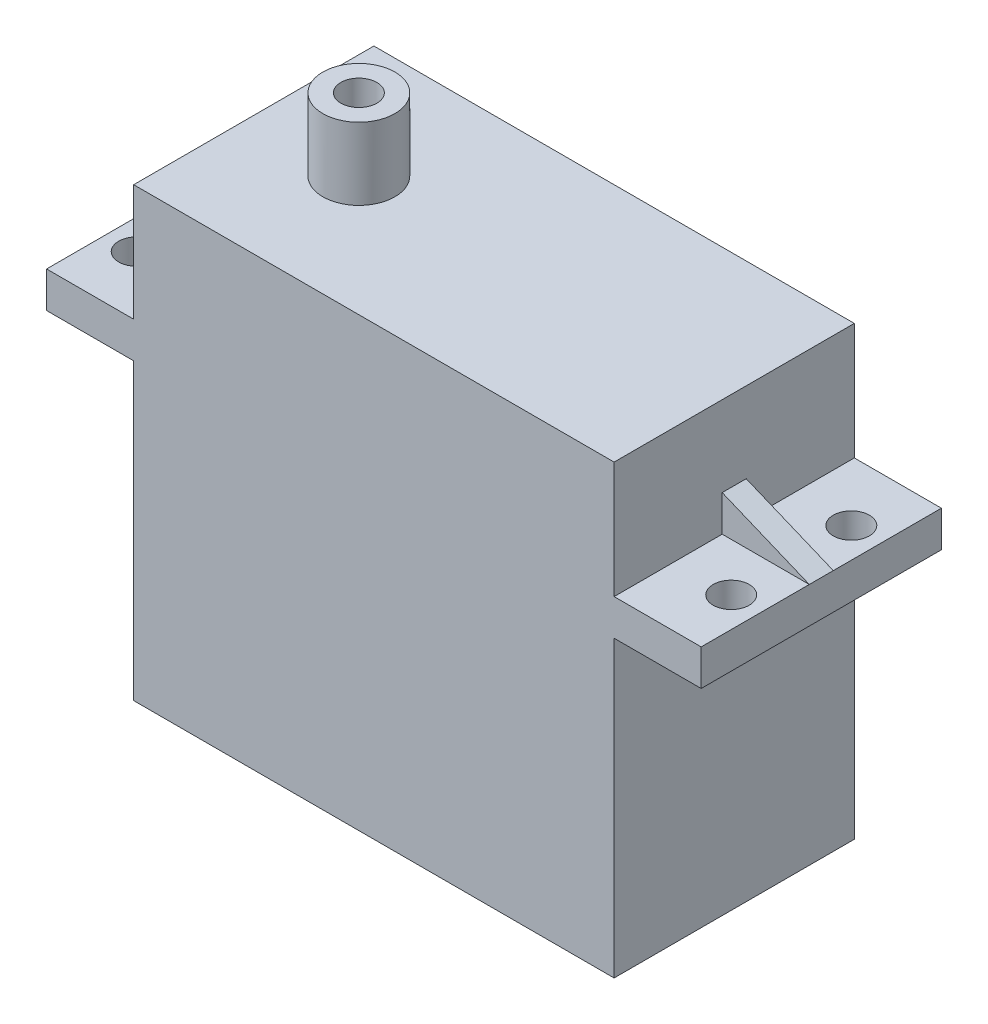
ISO-10303-21;
HEADER;
FILE_DESCRIPTION(('STEP AP214'),'2;1');
FILE_NAME('part.step','',(''),(''),'','','');
FILE_SCHEMA(('AUTOMOTIVE_DESIGN { 1 0 10303 214 1 1 1 1 }'));
ENDSEC;
DATA;
#1=APPLICATION_CONTEXT('core data for automotive mechanical design processes');
#2=APPLICATION_PROTOCOL_DEFINITION('international standard','automotive_design',2000,#1);
#3=PRODUCT_CONTEXT('',#1,'mechanical');
#4=PRODUCT('Part','Part','',(#3));
#5=PRODUCT_RELATED_PRODUCT_CATEGORY('part','',(#4));
#6=PRODUCT_DEFINITION_FORMATION('','',#4);
#7=PRODUCT_DEFINITION_CONTEXT('part definition',#1,'design');
#8=PRODUCT_DEFINITION('design','',#6,#7);
#9=PRODUCT_DEFINITION_SHAPE('','',#8);
#10=(LENGTH_UNIT() NAMED_UNIT(*) SI_UNIT(.MILLI.,.METRE.));
#11=(NAMED_UNIT(*) PLANE_ANGLE_UNIT() SI_UNIT($,.RADIAN.));
#12=(NAMED_UNIT(*) SI_UNIT($,.STERADIAN.) SOLID_ANGLE_UNIT());
#13=UNCERTAINTY_MEASURE_WITH_UNIT(LENGTH_MEASURE(1.E-05),#10,'distance_accuracy_value','');
#14=(GEOMETRIC_REPRESENTATION_CONTEXT(3) GLOBAL_UNCERTAINTY_ASSIGNED_CONTEXT((#13)) GLOBAL_UNIT_ASSIGNED_CONTEXT((#10,
#11,#12)) REPRESENTATION_CONTEXT('',''));
#15=CARTESIAN_POINT('',(0.,0.,0.));
#16=DIRECTION('',(0.,0.,1.));
#17=DIRECTION('',(1.,0.,0.));
#18=AXIS2_PLACEMENT_3D('',#15,#16,#17);
#19=CARTESIAN_POINT('',(0.,27.5,0.));
#20=DIRECTION('',(0.,1.,0.));
#21=DIRECTION('',(0.,0.,1.));
#22=AXIS2_PLACEMENT_3D('',#19,#20,#21);
#23=PLANE('',#22);
#24=CARTESIAN_POINT('',(24.75,27.5,-5.));
#25=DIRECTION('',(0.,-1.,0.));
#26=DIRECTION('',(0.,0.,-1.));
#27=AXIS2_PLACEMENT_3D('',#24,#25,#26);
#28=CIRCLE('',#27,1.5);
#29=CARTESIAN_POINT('',(24.75,27.5,-6.5));
#30=VERTEX_POINT('',#29);
#31=EDGE_CURVE('E382',#30,#30,#28,.T.);
#32=ORIENTED_EDGE('',*,*,#31,.T.);
#33=EDGE_LOOP('',(#32));
#34=FACE_BOUND('',#33,.T.);
#35=DIRECTION('',(0.,0.,-1.));
#36=VECTOR('',#35,1.);
#37=CARTESIAN_POINT('',(20.,27.5,-10.));
#38=LINE('',#37,#36);
#39=CARTESIAN_POINT('',(20.,27.5,-1.));
#40=VERTEX_POINT('',#39);
#41=CARTESIAN_POINT('',(20.,27.5,-10.));
#42=VERTEX_POINT('',#41);
#43=EDGE_CURVE('E216',#40,#42,#38,.T.);
#44=ORIENTED_EDGE('',*,*,#43,.F.);
#45=DIRECTION('',(1.,0.,0.));
#46=VECTOR('',#45,1.);
#47=CARTESIAN_POINT('',(20.,27.5,-1.));
#48=LINE('',#47,#46);
#49=CARTESIAN_POINT('',(27.25,27.5,-1.));
#50=VERTEX_POINT('',#49);
#51=EDGE_CURVE('E410',#40,#50,#48,.T.);
#52=ORIENTED_EDGE('',*,*,#51,.T.);
#53=DIRECTION('',(0.,0.,1.));
#54=VECTOR('',#53,1.);
#55=CARTESIAN_POINT('',(27.25,27.5,-10.));
#56=LINE('',#55,#54);
#57=CARTESIAN_POINT('',(27.25,27.5,-10.));
#58=VERTEX_POINT('',#57);
#59=EDGE_CURVE('E387',#58,#50,#56,.T.);
#60=ORIENTED_EDGE('',*,*,#59,.F.);
#61=DIRECTION('',(1.,0.,0.));
#62=VECTOR('',#61,1.);
#63=CARTESIAN_POINT('',(-27.25,27.5,-10.));
#64=LINE('',#63,#62);
#65=EDGE_CURVE('E396',#42,#58,#64,.T.);
#66=ORIENTED_EDGE('',*,*,#65,.F.);
#67=EDGE_LOOP('',(#44,#52,#60,#66));
#68=FACE_BOUND('',#67,.T.);
#69=ADVANCED_FACE('F40',(#34,#68),#23,.T.);
#70=CARTESIAN_POINT('',(-24.75,27.5,-5.));
#71=DIRECTION('',(0.,-1.,0.));
#72=DIRECTION('',(0.,0.,-1.));
#73=AXIS2_PLACEMENT_3D('',#70,#71,#72);
#74=CIRCLE('',#73,1.5);
#75=CARTESIAN_POINT('',(-24.75,27.5,-6.5));
#76=VERTEX_POINT('',#75);
#77=EDGE_CURVE('E364',#76,#76,#74,.T.);
#78=ORIENTED_EDGE('',*,*,#77,.T.);
#79=EDGE_LOOP('',(#78));
#80=FACE_BOUND('',#79,.T.);
#81=DIRECTION('',(0.,0.,-1.));
#82=VECTOR('',#81,1.);
#83=CARTESIAN_POINT('',(-27.25,27.5,-10.));
#84=LINE('',#83,#82);
#85=CARTESIAN_POINT('',(-27.25,27.5,-1.));
#86=VERTEX_POINT('',#85);
#87=CARTESIAN_POINT('',(-27.25,27.5,-10.));
#88=VERTEX_POINT('',#87);
#89=EDGE_CURVE('E393',#86,#88,#84,.T.);
#90=ORIENTED_EDGE('',*,*,#89,.F.);
#91=DIRECTION('',(1.,0.,0.));
#92=VECTOR('',#91,1.);
#93=CARTESIAN_POINT('',(-20.,27.5,-1.));
#94=LINE('',#93,#92);
#95=CARTESIAN_POINT('',(-20.,27.5,-1.));
#96=VERTEX_POINT('',#95);
#97=EDGE_CURVE('E63',#86,#96,#94,.T.);
#98=ORIENTED_EDGE('',*,*,#97,.T.);
#99=DIRECTION('',(0.,0.,1.));
#100=VECTOR('',#99,1.);
#101=CARTESIAN_POINT('',(-20.,27.5,-9.99999999999999));
#102=LINE('',#101,#100);
#103=CARTESIAN_POINT('',(-20.,27.5,-9.99999999999999));
#104=VERTEX_POINT('',#103);
#105=EDGE_CURVE('E218',#104,#96,#102,.T.);
#106=ORIENTED_EDGE('',*,*,#105,.F.);
#107=EDGE_CURVE('E308',#88,#104,#64,.T.);
#108=ORIENTED_EDGE('',*,*,#107,.F.);
#109=EDGE_LOOP('',(#90,#98,#106,#108));
#110=FACE_BOUND('',#109,.T.);
#111=ADVANCED_FACE('F458',(#80,#110),#23,.T.);
#112=CARTESIAN_POINT('',(-20.,37.2,-9.99999999999999));
#113=DIRECTION('',(1.,0.,0.));
#114=DIRECTION('',(0.,0.,-1.));
#115=AXIS2_PLACEMENT_3D('',#112,#113,#114);
#116=PLANE('',#115);
#117=DIRECTION('',(0.,-1.,0.));
#118=VECTOR('',#117,1.);
#119=CARTESIAN_POINT('',(-20.,2.07875675331885,-3.56328431820432));
#120=LINE('',#119,#118);
#121=CARTESIAN_POINT('',(-20.,2.07875675331885,-3.56328431820432));
#122=VERTEX_POINT('',#121);
#123=CARTESIAN_POINT('',(-20.,0.,-3.56328431820432));
#124=VERTEX_POINT('',#123);
#125=EDGE_CURVE('E321',#122,#124,#120,.T.);
#126=ORIENTED_EDGE('',*,*,#125,.F.);
#127=DIRECTION('',(0.,0.,-1.));
#128=VECTOR('',#127,1.);
#129=CARTESIAN_POINT('',(-20.,2.07875675331885,3.56328431820432));
#130=LINE('',#129,#128);
#131=CARTESIAN_POINT('',(-20.,2.07875675331885,3.56328431820432));
#132=VERTEX_POINT('',#131);
#133=EDGE_CURVE('E323',#132,#122,#130,.T.);
#134=ORIENTED_EDGE('',*,*,#133,.F.);
#135=DIRECTION('',(0.,1.,0.));
#136=VECTOR('',#135,1.);
#137=CARTESIAN_POINT('',(-20.,2.07875675331885,3.56328431820432));
#138=LINE('',#137,#136);
#139=CARTESIAN_POINT('',(-20.,0.,3.56328431820432));
#140=VERTEX_POINT('',#139);
#141=EDGE_CURVE('E327',#140,#132,#138,.T.);
#142=ORIENTED_EDGE('',*,*,#141,.F.);
#143=DIRECTION('',(0.,0.,1.));
#144=VECTOR('',#143,1.);
#145=CARTESIAN_POINT('',(-20.,0.,-9.99999999999999));
#146=LINE('',#145,#144);
#147=CARTESIAN_POINT('',(-20.,0.,10.));
#148=VERTEX_POINT('',#147);
#149=EDGE_CURVE('E225',#140,#148,#146,.T.);
#150=ORIENTED_EDGE('',*,*,#149,.T.);
#151=DIRECTION('',(0.,-1.,0.));
#152=VECTOR('',#151,1.);
#153=CARTESIAN_POINT('',(-20.,37.2,10.));
#154=LINE('',#153,#152);
#155=CARTESIAN_POINT('',(-20.,24.5,10.));
#156=VERTEX_POINT('',#155);
#157=EDGE_CURVE('E254',#156,#148,#154,.T.);
#158=ORIENTED_EDGE('',*,*,#157,.F.);
#159=DIRECTION('',(0.,0.,1.));
#160=VECTOR('',#159,1.);
#161=CARTESIAN_POINT('',(-20.,24.5,-9.99999999999999));
#162=LINE('',#161,#160);
#163=CARTESIAN_POINT('',(-20.,24.5,-9.99999999999999));
#164=VERTEX_POINT('',#163);
#165=EDGE_CURVE('E220',#164,#156,#162,.T.);
#166=ORIENTED_EDGE('',*,*,#165,.F.);
#167=DIRECTION('',(0.,-1.,0.));
#168=VECTOR('',#167,1.);
#169=CARTESIAN_POINT('',(-20.,37.2,-9.99999999999999));
#170=LINE('',#169,#168);
#171=CARTESIAN_POINT('',(-20.,0.,-9.99999999999999));
#172=VERTEX_POINT('',#171);
#173=EDGE_CURVE('E236',#164,#172,#170,.T.);
#174=ORIENTED_EDGE('',*,*,#173,.T.);
#175=EDGE_CURVE('E237',#172,#124,#146,.T.);
#176=ORIENTED_EDGE('',*,*,#175,.T.);
#177=EDGE_LOOP('',(#126,#134,#142,#150,#158,#166,#174,#176));
#178=FACE_BOUND('',#177,.T.);
#179=ADVANCED_FACE('F313',(#178),#116,.F.);
#180=CARTESIAN_POINT('',(20.,37.2,-10.));
#181=DIRECTION('',(-1.,0.,0.));
#182=DIRECTION('',(0.,0.,1.));
#183=AXIS2_PLACEMENT_3D('',#180,#181,#182);
#184=PLANE('',#183);
#185=DIRECTION('',(0.,0.,-1.));
#186=VECTOR('',#185,1.);
#187=CARTESIAN_POINT('',(20.,24.5,-10.));
#188=LINE('',#187,#186);
#189=CARTESIAN_POINT('',(20.,24.5,10.));
#190=VERTEX_POINT('',#189);
#191=CARTESIAN_POINT('',(20.,24.5,-10.));
#192=VERTEX_POINT('',#191);
#193=EDGE_CURVE('E278',#190,#192,#188,.T.);
#194=ORIENTED_EDGE('',*,*,#193,.F.);
#195=DIRECTION('',(0.,-1.,0.));
#196=VECTOR('',#195,1.);
#197=CARTESIAN_POINT('',(20.,37.2,10.));
#198=LINE('',#197,#196);
#199=CARTESIAN_POINT('',(20.,0.,10.));
#200=VERTEX_POINT('',#199);
#201=EDGE_CURVE('E253',#190,#200,#198,.T.);
#202=ORIENTED_EDGE('',*,*,#201,.T.);
#203=DIRECTION('',(0.,0.,-1.));
#204=VECTOR('',#203,1.);
#205=CARTESIAN_POINT('',(20.,0.,-10.));
#206=LINE('',#205,#204);
#207=CARTESIAN_POINT('',(20.,0.,-10.));
#208=VERTEX_POINT('',#207);
#209=EDGE_CURVE('E242',#200,#208,#206,.T.);
#210=ORIENTED_EDGE('',*,*,#209,.T.);
#211=DIRECTION('',(0.,-1.,0.));
#212=VECTOR('',#211,1.);
#213=CARTESIAN_POINT('',(20.,37.2,-10.));
#214=LINE('',#213,#212);
#215=EDGE_CURVE('E249',#192,#208,#214,.T.);
#216=ORIENTED_EDGE('',*,*,#215,.F.);
#217=EDGE_LOOP('',(#194,#202,#210,#216));
#218=FACE_BOUND('',#217,.T.);
#219=ADVANCED_FACE('F276',(#218),#184,.F.);
#220=DIRECTION('',(0.,0.,-1.));
#221=VECTOR('',#220,1.);
#222=CARTESIAN_POINT('',(-20.,30.5,1.));
#223=LINE('',#222,#221);
#224=CARTESIAN_POINT('',(-20.,30.5,1.));
#225=VERTEX_POINT('',#224);
#226=CARTESIAN_POINT('',(-20.,30.5,-1.));
#227=VERTEX_POINT('',#226);
#228=EDGE_CURVE('E328',#225,#227,#223,.T.);
#229=ORIENTED_EDGE('',*,*,#228,.F.);
#230=DIRECTION('',(0.,1.,0.));
#231=VECTOR('',#230,1.);
#232=CARTESIAN_POINT('',(-20.,30.5,1.));
#233=LINE('',#232,#231);
#234=CARTESIAN_POINT('',(-20.,27.5,1.));
#235=VERTEX_POINT('',#234);
#236=EDGE_CURVE('E424',#235,#225,#233,.T.);
#237=ORIENTED_EDGE('',*,*,#236,.F.);
#238=CARTESIAN_POINT('',(-20.,27.5,10.));
#239=VERTEX_POINT('',#238);
#240=EDGE_CURVE('E215',#235,#239,#102,.T.);
#241=ORIENTED_EDGE('',*,*,#240,.T.);
#242=CARTESIAN_POINT('',(-20.,37.2,10.));
#243=VERTEX_POINT('',#242);
#244=EDGE_CURVE('E48',#243,#239,#154,.T.);
#245=ORIENTED_EDGE('',*,*,#244,.F.);
#246=DIRECTION('',(0.,0.,1.));
#247=VECTOR('',#246,1.);
#248=CARTESIAN_POINT('',(-20.,37.2,-9.99999999999999));
#249=LINE('',#248,#247);
#250=CARTESIAN_POINT('',(-20.,37.2,-9.99999999999999));
#251=VERTEX_POINT('',#250);
#252=EDGE_CURVE('E226',#251,#243,#249,.T.);
#253=ORIENTED_EDGE('',*,*,#252,.F.);
#254=EDGE_CURVE('E247',#251,#104,#170,.T.);
#255=ORIENTED_EDGE('',*,*,#254,.T.);
#256=ORIENTED_EDGE('',*,*,#105,.T.);
#257=DIRECTION('',(0.,1.,0.));
#258=VECTOR('',#257,1.);
#259=CARTESIAN_POINT('',(-20.,30.5,-1.));
#260=LINE('',#259,#258);
#261=EDGE_CURVE('E431',#96,#227,#260,.T.);
#262=ORIENTED_EDGE('',*,*,#261,.T.);
#263=EDGE_LOOP('',(#229,#237,#241,#245,#253,#255,#256,#262));
#264=FACE_BOUND('',#263,.T.);
#265=ADVANCED_FACE('F42',(#264),#116,.F.);
#266=CARTESIAN_POINT('',(20.,37.2,10.));
#267=DIRECTION('',(0.,0.,-1.));
#268=DIRECTION('',(-1.,0.,0.));
#269=AXIS2_PLACEMENT_3D('',#266,#267,#268);
#270=PLANE('',#269);
#271=ORIENTED_EDGE('',*,*,#244,.T.);
#272=DIRECTION('',(-1.,0.,0.));
#273=VECTOR('',#272,1.);
#274=CARTESIAN_POINT('',(-27.25,27.5,10.));
#275=LINE('',#274,#273);
#276=CARTESIAN_POINT('',(-27.25,27.5,10.));
#277=VERTEX_POINT('',#276);
#278=EDGE_CURVE('E390',#239,#277,#275,.T.);
#279=ORIENTED_EDGE('',*,*,#278,.T.);
#280=DIRECTION('',(0.,-1.,0.));
#281=VECTOR('',#280,1.);
#282=CARTESIAN_POINT('',(-27.25,27.5,10.));
#283=LINE('',#282,#281);
#284=CARTESIAN_POINT('',(-27.25,24.5,10.));
#285=VERTEX_POINT('',#284);
#286=EDGE_CURVE('E305',#277,#285,#283,.T.);
#287=ORIENTED_EDGE('',*,*,#286,.T.);
#288=DIRECTION('',(-1.,0.,0.));
#289=VECTOR('',#288,1.);
#290=CARTESIAN_POINT('',(-27.25,24.5,10.));
#291=LINE('',#290,#289);
#292=EDGE_CURVE('E266',#156,#285,#291,.T.);
#293=ORIENTED_EDGE('',*,*,#292,.F.);
#294=ORIENTED_EDGE('',*,*,#157,.T.);
#295=DIRECTION('',(1.,0.,0.));
#296=VECTOR('',#295,1.);
#297=CARTESIAN_POINT('',(20.,0.,10.));
#298=LINE('',#297,#296);
#299=EDGE_CURVE('E239',#148,#200,#298,.T.);
#300=ORIENTED_EDGE('',*,*,#299,.T.);
#301=ORIENTED_EDGE('',*,*,#201,.F.);
#302=CARTESIAN_POINT('',(27.25,24.5,10.));
#303=VERTEX_POINT('',#302);
#304=EDGE_CURVE('E282',#303,#190,#291,.T.);
#305=ORIENTED_EDGE('',*,*,#304,.F.);
#306=DIRECTION('',(0.,-1.,0.));
#307=VECTOR('',#306,1.);
#308=CARTESIAN_POINT('',(27.25,27.5,10.));
#309=LINE('',#308,#307);
#310=CARTESIAN_POINT('',(27.25,27.5,10.));
#311=VERTEX_POINT('',#310);
#312=EDGE_CURVE('E307',#311,#303,#309,.T.);
#313=ORIENTED_EDGE('',*,*,#312,.F.);
#314=CARTESIAN_POINT('',(20.,27.5,10.));
#315=VERTEX_POINT('',#314);
#316=EDGE_CURVE('E391',#311,#315,#275,.T.);
#317=ORIENTED_EDGE('',*,*,#316,.T.);
#318=CARTESIAN_POINT('',(20.,37.2,10.));
#319=VERTEX_POINT('',#318);
#320=EDGE_CURVE('E214',#319,#315,#198,.T.);
#321=ORIENTED_EDGE('',*,*,#320,.F.);
#322=DIRECTION('',(1.,0.,0.));
#323=VECTOR('',#322,1.);
#324=CARTESIAN_POINT('',(20.,37.2,10.));
#325=LINE('',#324,#323);
#326=EDGE_CURVE('E229',#243,#319,#325,.T.);
#327=ORIENTED_EDGE('',*,*,#326,.F.);
#328=EDGE_LOOP('',(#271,#279,#287,#293,#294,#300,#301,#305,#313,#317,#321,#327));
#329=FACE_BOUND('',#328,.T.);
#330=ADVANCED_FACE('F262',(#329),#270,.F.);
#331=CARTESIAN_POINT('',(20.,27.5,1.));
#332=VERTEX_POINT('',#331);
#333=EDGE_CURVE('E206',#315,#332,#38,.T.);
#334=ORIENTED_EDGE('',*,*,#333,.T.);
#335=DIRECTION('',(0.,-1.,0.));
#336=VECTOR('',#335,1.);
#337=CARTESIAN_POINT('',(20.,30.5,1.));
#338=LINE('',#337,#336);
#339=CARTESIAN_POINT('',(20.,30.5,1.));
#340=VERTEX_POINT('',#339);
#341=EDGE_CURVE('E189',#340,#332,#338,.T.);
#342=ORIENTED_EDGE('',*,*,#341,.F.);
#343=DIRECTION('',(0.,0.,-1.));
#344=VECTOR('',#343,1.);
#345=CARTESIAN_POINT('',(20.,30.5,1.));
#346=LINE('',#345,#344);
#347=CARTESIAN_POINT('',(20.,30.5,-1.));
#348=VERTEX_POINT('',#347);
#349=EDGE_CURVE('E418',#340,#348,#346,.T.);
#350=ORIENTED_EDGE('',*,*,#349,.T.);
#351=DIRECTION('',(0.,-1.,0.));
#352=VECTOR('',#351,1.);
#353=CARTESIAN_POINT('',(20.,30.5,-1.));
#354=LINE('',#353,#352);
#355=EDGE_CURVE('E412',#348,#40,#354,.T.);
#356=ORIENTED_EDGE('',*,*,#355,.T.);
#357=ORIENTED_EDGE('',*,*,#43,.T.);
#358=CARTESIAN_POINT('',(20.,37.2,-10.));
#359=VERTEX_POINT('',#358);
#360=EDGE_CURVE('E250',#359,#42,#214,.T.);
#361=ORIENTED_EDGE('',*,*,#360,.F.);
#362=DIRECTION('',(0.,0.,-1.));
#363=VECTOR('',#362,1.);
#364=CARTESIAN_POINT('',(20.,37.2,-10.));
#365=LINE('',#364,#363);
#366=EDGE_CURVE('E232',#319,#359,#365,.T.);
#367=ORIENTED_EDGE('',*,*,#366,.F.);
#368=ORIENTED_EDGE('',*,*,#320,.T.);
#369=EDGE_LOOP('',(#334,#342,#350,#356,#357,#361,#367,#368));
#370=FACE_BOUND('',#369,.T.);
#371=ADVANCED_FACE('F211',(#370),#184,.F.);
#372=CARTESIAN_POINT('',(20.,37.2,-10.));
#373=DIRECTION('',(0.,0.,1.));
#374=DIRECTION('',(1.,0.,0.));
#375=AXIS2_PLACEMENT_3D('',#372,#373,#374);
#376=PLANE('',#375);
#377=ORIENTED_EDGE('',*,*,#360,.T.);
#378=ORIENTED_EDGE('',*,*,#65,.T.);
#379=DIRECTION('',(0.,-1.,0.));
#380=VECTOR('',#379,1.);
#381=CARTESIAN_POINT('',(27.25,27.5,-10.));
#382=LINE('',#381,#380);
#383=CARTESIAN_POINT('',(27.25,24.5,-10.));
#384=VERTEX_POINT('',#383);
#385=EDGE_CURVE('E300',#58,#384,#382,.T.);
#386=ORIENTED_EDGE('',*,*,#385,.T.);
#387=DIRECTION('',(1.,0.,0.));
#388=VECTOR('',#387,1.);
#389=CARTESIAN_POINT('',(-27.25,24.5,-10.));
#390=LINE('',#389,#388);
#391=EDGE_CURVE('E292',#192,#384,#390,.T.);
#392=ORIENTED_EDGE('',*,*,#391,.F.);
#393=ORIENTED_EDGE('',*,*,#215,.T.);
#394=DIRECTION('',(-1.,0.,0.));
#395=VECTOR('',#394,1.);
#396=CARTESIAN_POINT('',(20.,0.,-10.));
#397=LINE('',#396,#395);
#398=EDGE_CURVE('E230',#208,#172,#397,.T.);
#399=ORIENTED_EDGE('',*,*,#398,.T.);
#400=ORIENTED_EDGE('',*,*,#173,.F.);
#401=CARTESIAN_POINT('',(-27.25,24.5,-10.));
#402=VERTEX_POINT('',#401);
#403=EDGE_CURVE('E297',#402,#164,#390,.T.);
#404=ORIENTED_EDGE('',*,*,#403,.F.);
#405=DIRECTION('',(0.,-1.,0.));
#406=VECTOR('',#405,1.);
#407=CARTESIAN_POINT('',(-27.25,27.5,-10.));
#408=LINE('',#407,#406);
#409=EDGE_CURVE('E303',#88,#402,#408,.T.);
#410=ORIENTED_EDGE('',*,*,#409,.F.);
#411=ORIENTED_EDGE('',*,*,#107,.T.);
#412=ORIENTED_EDGE('',*,*,#254,.F.);
#413=DIRECTION('',(-1.,0.,0.));
#414=VECTOR('',#413,1.);
#415=CARTESIAN_POINT('',(20.,37.2,-10.));
#416=LINE('',#415,#414);
#417=EDGE_CURVE('E234',#359,#251,#416,.T.);
#418=ORIENTED_EDGE('',*,*,#417,.F.);
#419=EDGE_LOOP('',(#377,#378,#386,#392,#393,#399,#400,#404,#410,#411,#412,#418));
#420=FACE_BOUND('',#419,.T.);
#421=ADVANCED_FACE('F315',(#420),#376,.F.);
#422=CARTESIAN_POINT('',(0.,37.2,0.));
#423=DIRECTION('',(0.,-1.,0.));
#424=DIRECTION('',(0.,0.,-1.));
#425=AXIS2_PLACEMENT_3D('',#422,#423,#424);
#426=PLANE('',#425);
#427=CARTESIAN_POINT('',(-11.25,37.2,0.));
#428=DIRECTION('',(0.,-1.,0.));
#429=DIRECTION('',(0.,0.,-1.));
#430=AXIS2_PLACEMENT_3D('',#427,#428,#429);
#431=CIRCLE('',#430,3.);
#432=CARTESIAN_POINT('',(-11.25,37.2,-3.));
#433=VERTEX_POINT('',#432);
#434=EDGE_CURVE('E11',#433,#433,#431,.F.);
#435=ORIENTED_EDGE('',*,*,#434,.F.);
#436=EDGE_LOOP('',(#435));
#437=FACE_BOUND('',#436,.T.);
#438=ORIENTED_EDGE('',*,*,#252,.T.);
#439=ORIENTED_EDGE('',*,*,#326,.T.);
#440=ORIENTED_EDGE('',*,*,#366,.T.);
#441=ORIENTED_EDGE('',*,*,#417,.T.);
#442=EDGE_LOOP('',(#438,#439,#440,#441));
#443=FACE_BOUND('',#442,.T.);
#444=ADVANCED_FACE('F651',(#437,#443),#426,.F.);
#445=CARTESIAN_POINT('',(0.,0.,0.));
#446=DIRECTION('',(0.,-1.,0.));
#447=DIRECTION('',(0.,0.,-1.));
#448=AXIS2_PLACEMENT_3D('',#445,#446,#447);
#449=PLANE('',#448);
#450=ORIENTED_EDGE('',*,*,#175,.F.);
#451=ORIENTED_EDGE('',*,*,#398,.F.);
#452=ORIENTED_EDGE('',*,*,#209,.F.);
#453=ORIENTED_EDGE('',*,*,#299,.F.);
#454=ORIENTED_EDGE('',*,*,#149,.F.);
#455=DIRECTION('',(1.,0.,0.));
#456=VECTOR('',#455,1.);
#457=CARTESIAN_POINT('',(-23.,0.,3.56328431820432));
#458=LINE('',#457,#456);
#459=CARTESIAN_POINT('',(-23.,0.,3.56328431820432));
#460=VERTEX_POINT('',#459);
#461=EDGE_CURVE('E345',#460,#140,#458,.T.);
#462=ORIENTED_EDGE('',*,*,#461,.F.);
#463=DIRECTION('',(0.,0.,1.));
#464=VECTOR('',#463,1.);
#465=CARTESIAN_POINT('',(-23.,0.,3.56328431820432));
#466=LINE('',#465,#464);
#467=CARTESIAN_POINT('',(-23.,0.,-3.56328431820432));
#468=VERTEX_POINT('',#467);
#469=EDGE_CURVE('E439',#468,#460,#466,.T.);
#470=ORIENTED_EDGE('',*,*,#469,.F.);
#471=DIRECTION('',(1.,0.,0.));
#472=VECTOR('',#471,1.);
#473=CARTESIAN_POINT('',(-23.,0.,-3.56328431820432));
#474=LINE('',#473,#472);
#475=EDGE_CURVE('E319',#468,#124,#474,.T.);
#476=ORIENTED_EDGE('',*,*,#475,.T.);
#477=EDGE_LOOP('',(#450,#451,#452,#453,#454,#462,#470,#476));
#478=FACE_BOUND('',#477,.T.);
#479=ADVANCED_FACE('F271',(#478),#449,.T.);
#480=CARTESIAN_POINT('',(27.25,27.5,-10.));
#481=DIRECTION('',(1.,0.,0.));
#482=DIRECTION('',(0.,0.,-1.));
#483=AXIS2_PLACEMENT_3D('',#480,#481,#482);
#484=PLANE('',#483);
#485=DIRECTION('',(0.,0.,1.));
#486=VECTOR('',#485,1.);
#487=CARTESIAN_POINT('',(27.25,24.5,-10.));
#488=LINE('',#487,#486);
#489=EDGE_CURVE('E288',#384,#303,#488,.T.);
#490=ORIENTED_EDGE('',*,*,#489,.F.);
#491=ORIENTED_EDGE('',*,*,#385,.F.);
#492=ORIENTED_EDGE('',*,*,#59,.T.);
#493=DIRECTION('',(0.,0.,-1.));
#494=VECTOR('',#493,1.);
#495=CARTESIAN_POINT('',(27.25,27.5,1.));
#496=LINE('',#495,#494);
#497=CARTESIAN_POINT('',(27.25,27.5,1.));
#498=VERTEX_POINT('',#497);
#499=EDGE_CURVE('E420',#498,#50,#496,.T.);
#500=ORIENTED_EDGE('',*,*,#499,.F.);
#501=EDGE_CURVE('E208',#498,#311,#56,.T.);
#502=ORIENTED_EDGE('',*,*,#501,.T.);
#503=ORIENTED_EDGE('',*,*,#312,.T.);
#504=EDGE_LOOP('',(#490,#491,#492,#500,#502,#503));
#505=FACE_BOUND('',#504,.T.);
#506=ADVANCED_FACE('F408',(#505),#484,.T.);
#507=CARTESIAN_POINT('',(24.75,27.5,5.));
#508=DIRECTION('',(0.,-1.,0.));
#509=DIRECTION('',(0.,0.,-1.));
#510=AXIS2_PLACEMENT_3D('',#507,#508,#509);
#511=CYLINDRICAL_SURFACE('',#510,1.5);
#512=CARTESIAN_POINT('',(24.75,27.5,5.));
#513=DIRECTION('',(0.,-1.,0.));
#514=DIRECTION('',(0.,0.,-1.));
#515=AXIS2_PLACEMENT_3D('',#512,#513,#514);
#516=CIRCLE('',#515,1.5);
#517=CARTESIAN_POINT('',(24.75,27.5,3.5));
#518=VERTEX_POINT('',#517);
#519=EDGE_CURVE('E376',#518,#518,#516,.T.);
#520=ORIENTED_EDGE('',*,*,#519,.F.);
#521=EDGE_LOOP('',(#520));
#522=FACE_BOUND('',#521,.T.);
#523=CARTESIAN_POINT('',(24.75,24.5,5.));
#524=DIRECTION('',(0.,-1.,0.));
#525=DIRECTION('',(0.,0.,-1.));
#526=AXIS2_PLACEMENT_3D('',#523,#524,#525);
#527=CIRCLE('',#526,1.5);
#528=CARTESIAN_POINT('',(24.75,24.5,3.5));
#529=VERTEX_POINT('',#528);
#530=EDGE_CURVE('E373',#529,#529,#527,.T.);
#531=ORIENTED_EDGE('',*,*,#530,.T.);
#532=EDGE_LOOP('',(#531));
#533=FACE_BOUND('',#532,.T.);
#534=ADVANCED_FACE('F484',(#522,#533),#511,.F.);
#535=CARTESIAN_POINT('',(24.75,27.5,-5.));
#536=DIRECTION('',(0.,-1.,0.));
#537=DIRECTION('',(0.,0.,-1.));
#538=AXIS2_PLACEMENT_3D('',#535,#536,#537);
#539=CYLINDRICAL_SURFACE('',#538,1.5);
#540=ORIENTED_EDGE('',*,*,#31,.F.);
#541=EDGE_LOOP('',(#540));
#542=FACE_BOUND('',#541,.T.);
#543=CARTESIAN_POINT('',(24.75,24.5,-5.));
#544=DIRECTION('',(0.,-1.,0.));
#545=DIRECTION('',(0.,0.,-1.));
#546=AXIS2_PLACEMENT_3D('',#543,#544,#545);
#547=CIRCLE('',#546,1.5);
#548=CARTESIAN_POINT('',(24.75,24.5,-6.5));
#549=VERTEX_POINT('',#548);
#550=EDGE_CURVE('E379',#549,#549,#547,.T.);
#551=ORIENTED_EDGE('',*,*,#550,.T.);
#552=EDGE_LOOP('',(#551));
#553=FACE_BOUND('',#552,.T.);
#554=ADVANCED_FACE('F480',(#542,#553),#539,.F.);
#555=DIRECTION('',(1.,0.,0.));
#556=VECTOR('',#555,1.);
#557=CARTESIAN_POINT('',(20.,27.5,1.));
#558=LINE('',#557,#556);
#559=EDGE_CURVE('E192',#332,#498,#558,.T.);
#560=ORIENTED_EDGE('',*,*,#559,.F.);
#561=ORIENTED_EDGE('',*,*,#333,.F.);
#562=ORIENTED_EDGE('',*,*,#316,.F.);
#563=ORIENTED_EDGE('',*,*,#501,.F.);
#564=EDGE_LOOP('',(#560,#561,#562,#563));
#565=FACE_BOUND('',#564,.T.);
#566=ORIENTED_EDGE('',*,*,#519,.T.);
#567=EDGE_LOOP('',(#566));
#568=FACE_BOUND('',#567,.T.);
#569=ADVANCED_FACE('F203',(#565,#568),#23,.T.);
#570=CARTESIAN_POINT('',(0.,24.5,0.));
#571=DIRECTION('',(0.,1.,0.));
#572=DIRECTION('',(0.,0.,1.));
#573=AXIS2_PLACEMENT_3D('',#570,#571,#572);
#574=PLANE('',#573);
#575=ORIENTED_EDGE('',*,*,#550,.F.);
#576=EDGE_LOOP('',(#575));
#577=FACE_BOUND('',#576,.T.);
#578=ORIENTED_EDGE('',*,*,#530,.F.);
#579=EDGE_LOOP('',(#578));
#580=FACE_BOUND('',#579,.T.);
#581=ORIENTED_EDGE('',*,*,#304,.T.);
#582=ORIENTED_EDGE('',*,*,#193,.T.);
#583=ORIENTED_EDGE('',*,*,#391,.T.);
#584=ORIENTED_EDGE('',*,*,#489,.T.);
#585=EDGE_LOOP('',(#581,#582,#583,#584));
#586=FACE_BOUND('',#585,.T.);
#587=ADVANCED_FACE('F285',(#577,#580,#586),#574,.F.);
#588=DIRECTION('',(1.,0.,0.));
#589=VECTOR('',#588,1.);
#590=CARTESIAN_POINT('',(-20.,27.5,1.));
#591=LINE('',#590,#589);
#592=CARTESIAN_POINT('',(-27.25,27.5,1.));
#593=VERTEX_POINT('',#592);
#594=EDGE_CURVE('E422',#593,#235,#591,.T.);
#595=ORIENTED_EDGE('',*,*,#594,.F.);
#596=EDGE_CURVE('E394',#277,#593,#84,.T.);
#597=ORIENTED_EDGE('',*,*,#596,.F.);
#598=ORIENTED_EDGE('',*,*,#278,.F.);
#599=ORIENTED_EDGE('',*,*,#240,.F.);
#600=EDGE_LOOP('',(#595,#597,#598,#599));
#601=FACE_BOUND('',#600,.T.);
#602=CARTESIAN_POINT('',(-24.75,27.5,5.));
#603=DIRECTION('',(0.,-1.,0.));
#604=DIRECTION('',(0.,0.,-1.));
#605=AXIS2_PLACEMENT_3D('',#602,#603,#604);
#606=CIRCLE('',#605,1.5);
#607=CARTESIAN_POINT('',(-24.75,27.5,3.5));
#608=VERTEX_POINT('',#607);
#609=EDGE_CURVE('E370',#608,#608,#606,.T.);
#610=ORIENTED_EDGE('',*,*,#609,.T.);
#611=EDGE_LOOP('',(#610));
#612=FACE_BOUND('',#611,.T.);
#613=ADVANCED_FACE('F461',(#601,#612),#23,.T.);
#614=CARTESIAN_POINT('',(-24.75,24.5,-5.));
#615=DIRECTION('',(0.,-1.,0.));
#616=DIRECTION('',(0.,0.,-1.));
#617=AXIS2_PLACEMENT_3D('',#614,#615,#616);
#618=CIRCLE('',#617,1.5);
#619=CARTESIAN_POINT('',(-24.75,24.5,-6.5));
#620=VERTEX_POINT('',#619);
#621=EDGE_CURVE('E363',#620,#620,#618,.T.);
#622=ORIENTED_EDGE('',*,*,#621,.F.);
#623=EDGE_LOOP('',(#622));
#624=FACE_BOUND('',#623,.T.);
#625=CARTESIAN_POINT('',(-24.75,24.5,5.));
#626=DIRECTION('',(0.,-1.,0.));
#627=DIRECTION('',(0.,0.,-1.));
#628=AXIS2_PLACEMENT_3D('',#625,#626,#627);
#629=CIRCLE('',#628,1.5);
#630=CARTESIAN_POINT('',(-24.75,24.5,3.5));
#631=VERTEX_POINT('',#630);
#632=EDGE_CURVE('E367',#631,#631,#629,.T.);
#633=ORIENTED_EDGE('',*,*,#632,.F.);
#634=EDGE_LOOP('',(#633));
#635=FACE_BOUND('',#634,.T.);
#636=ORIENTED_EDGE('',*,*,#403,.T.);
#637=ORIENTED_EDGE('',*,*,#165,.T.);
#638=ORIENTED_EDGE('',*,*,#292,.T.);
#639=DIRECTION('',(0.,0.,-1.));
#640=VECTOR('',#639,1.);
#641=CARTESIAN_POINT('',(-27.25,24.5,-10.));
#642=LINE('',#641,#640);
#643=EDGE_CURVE('E289',#285,#402,#642,.T.);
#644=ORIENTED_EDGE('',*,*,#643,.T.);
#645=EDGE_LOOP('',(#636,#637,#638,#644));
#646=FACE_BOUND('',#645,.T.);
#647=ADVANCED_FACE('F310',(#624,#635,#646),#574,.F.);
#648=CARTESIAN_POINT('',(-27.25,27.5,-10.));
#649=DIRECTION('',(-1.,0.,0.));
#650=DIRECTION('',(0.,0.,1.));
#651=AXIS2_PLACEMENT_3D('',#648,#649,#650);
#652=PLANE('',#651);
#653=ORIENTED_EDGE('',*,*,#643,.F.);
#654=ORIENTED_EDGE('',*,*,#286,.F.);
#655=ORIENTED_EDGE('',*,*,#596,.T.);
#656=DIRECTION('',(0.,0.,-1.));
#657=VECTOR('',#656,1.);
#658=CARTESIAN_POINT('',(-27.25,27.5,1.));
#659=LINE('',#658,#657);
#660=EDGE_CURVE('E429',#593,#86,#659,.T.);
#661=ORIENTED_EDGE('',*,*,#660,.T.);
#662=ORIENTED_EDGE('',*,*,#89,.T.);
#663=ORIENTED_EDGE('',*,*,#409,.T.);
#664=EDGE_LOOP('',(#653,#654,#655,#661,#662,#663));
#665=FACE_BOUND('',#664,.T.);
#666=ADVANCED_FACE('F474',(#665),#652,.T.);
#667=CARTESIAN_POINT('',(-24.75,27.5,5.));
#668=DIRECTION('',(0.,-1.,0.));
#669=DIRECTION('',(0.,0.,-1.));
#670=AXIS2_PLACEMENT_3D('',#667,#668,#669);
#671=CYLINDRICAL_SURFACE('',#670,1.5);
#672=ORIENTED_EDGE('',*,*,#609,.F.);
#673=EDGE_LOOP('',(#672));
#674=FACE_BOUND('',#673,.T.);
#675=ORIENTED_EDGE('',*,*,#632,.T.);
#676=EDGE_LOOP('',(#675));
#677=FACE_BOUND('',#676,.T.);
#678=ADVANCED_FACE('F494',(#674,#677),#671,.F.);
#679=CARTESIAN_POINT('',(-24.75,27.5,-5.));
#680=DIRECTION('',(0.,-1.,0.));
#681=DIRECTION('',(0.,0.,-1.));
#682=AXIS2_PLACEMENT_3D('',#679,#680,#681);
#683=CYLINDRICAL_SURFACE('',#682,1.5);
#684=ORIENTED_EDGE('',*,*,#77,.F.);
#685=EDGE_LOOP('',(#684));
#686=FACE_BOUND('',#685,.T.);
#687=ORIENTED_EDGE('',*,*,#621,.T.);
#688=EDGE_LOOP('',(#687));
#689=FACE_BOUND('',#688,.T.);
#690=ADVANCED_FACE('F497',(#686,#689),#683,.F.);
#691=CARTESIAN_POINT('',(-11.25,43.2,0.));
#692=DIRECTION('',(0.,1.,0.));
#693=DIRECTION('',(0.,0.,1.));
#694=AXIS2_PLACEMENT_3D('',#691,#692,#693);
#695=PLANE('',#694);
#696=CARTESIAN_POINT('',(-11.25,43.2,0.));
#697=DIRECTION('',(0.,1.,0.));
#698=DIRECTION('',(0.,0.,1.));
#699=AXIS2_PLACEMENT_3D('',#696,#697,#698);
#700=CIRCLE('',#699,3.);
#701=CARTESIAN_POINT('',(-11.25,43.2,3.));
#702=VERTEX_POINT('',#701);
#703=EDGE_CURVE('E358',#702,#702,#700,.T.);
#704=ORIENTED_EDGE('',*,*,#703,.T.);
#705=EDGE_LOOP('',(#704));
#706=FACE_BOUND('',#705,.T.);
#707=CARTESIAN_POINT('',(-11.25,43.2,0.));
#708=DIRECTION('',(0.,1.,0.));
#709=DIRECTION('',(0.,0.,1.));
#710=AXIS2_PLACEMENT_3D('',#707,#708,#709);
#711=CIRCLE('',#710,1.5);
#712=CARTESIAN_POINT('',(-11.25,43.2,1.5));
#713=VERTEX_POINT('',#712);
#714=EDGE_CURVE('E355',#713,#713,#711,.T.);
#715=ORIENTED_EDGE('',*,*,#714,.F.);
#716=EDGE_LOOP('',(#715));
#717=FACE_BOUND('',#716,.T.);
#718=ADVANCED_FACE('F501',(#706,#717),#695,.T.);
#719=CARTESIAN_POINT('',(-11.25,43.2,0.));
#720=DIRECTION('',(0.,-1.,0.));
#721=DIRECTION('',(0.,0.,-1.));
#722=AXIS2_PLACEMENT_3D('',#719,#720,#721);
#723=CYLINDRICAL_SURFACE('',#722,3.);
#724=ORIENTED_EDGE('',*,*,#703,.F.);
#725=EDGE_LOOP('',(#724));
#726=FACE_BOUND('',#725,.T.);
#727=ORIENTED_EDGE('',*,*,#434,.T.);
#728=EDGE_LOOP('',(#727));
#729=FACE_BOUND('',#728,.T.);
#730=ADVANCED_FACE('F503',(#726,#729),#723,.T.);
#731=CARTESIAN_POINT('',(-11.25,43.2,0.));
#732=DIRECTION('',(0.,-1.,0.));
#733=DIRECTION('',(0.,0.,-1.));
#734=AXIS2_PLACEMENT_3D('',#731,#732,#733);
#735=CYLINDRICAL_SURFACE('',#734,1.5);
#736=ORIENTED_EDGE('',*,*,#714,.T.);
#737=EDGE_LOOP('',(#736));
#738=FACE_BOUND('',#737,.T.);
#739=CARTESIAN_POINT('',(-11.25,37.2,0.));
#740=DIRECTION('',(0.,1.,0.));
#741=DIRECTION('',(0.,0.,1.));
#742=AXIS2_PLACEMENT_3D('',#739,#740,#741);
#743=CIRCLE('',#742,1.5);
#744=CARTESIAN_POINT('',(-11.25,37.2,1.5));
#745=VERTEX_POINT('',#744);
#746=EDGE_CURVE('E354',#745,#745,#743,.T.);
#747=ORIENTED_EDGE('',*,*,#746,.F.);
#748=EDGE_LOOP('',(#747));
#749=FACE_BOUND('',#748,.T.);
#750=ADVANCED_FACE('F506',(#738,#749),#735,.F.);
#751=ORIENTED_EDGE('',*,*,#746,.T.);
#752=EDGE_LOOP('',(#751));
#753=FACE_BOUND('',#752,.T.);
#754=ADVANCED_FACE('F513',(#753),#426,.F.);
#755=CARTESIAN_POINT('',(-23.,2.07875675331885,-3.56328431820432));
#756=DIRECTION('',(0.,0.,1.));
#757=DIRECTION('',(1.,0.,0.));
#758=AXIS2_PLACEMENT_3D('',#755,#756,#757);
#759=PLANE('',#758);
#760=ORIENTED_EDGE('',*,*,#125,.T.);
#761=ORIENTED_EDGE('',*,*,#475,.F.);
#762=DIRECTION('',(0.,-1.,0.));
#763=VECTOR('',#762,1.);
#764=CARTESIAN_POINT('',(-23.,2.07875675331885,-3.56328431820432));
#765=LINE('',#764,#763);
#766=CARTESIAN_POINT('',(-23.,2.07875675331885,-3.56328431820432));
#767=VERTEX_POINT('',#766);
#768=EDGE_CURVE('E339',#767,#468,#765,.T.);
#769=ORIENTED_EDGE('',*,*,#768,.F.);
#770=DIRECTION('',(1.,0.,0.));
#771=VECTOR('',#770,1.);
#772=CARTESIAN_POINT('',(-23.,2.07875675331885,-3.56328431820432));
#773=LINE('',#772,#771);
#774=EDGE_CURVE('E335',#767,#122,#773,.T.);
#775=ORIENTED_EDGE('',*,*,#774,.T.);
#776=EDGE_LOOP('',(#760,#761,#769,#775));
#777=FACE_BOUND('',#776,.T.);
#778=ADVANCED_FACE('F341',(#777),#759,.F.);
#779=CARTESIAN_POINT('',(-23.,2.07875675331885,3.56328431820432));
#780=DIRECTION('',(0.,0.,-1.));
#781=DIRECTION('',(-1.,0.,0.));
#782=AXIS2_PLACEMENT_3D('',#779,#780,#781);
#783=PLANE('',#782);
#784=ORIENTED_EDGE('',*,*,#141,.T.);
#785=DIRECTION('',(1.,0.,0.));
#786=VECTOR('',#785,1.);
#787=CARTESIAN_POINT('',(-23.,2.07875675331885,3.56328431820432));
#788=LINE('',#787,#786);
#789=CARTESIAN_POINT('',(-23.,2.07875675331885,3.56328431820432));
#790=VERTEX_POINT('',#789);
#791=EDGE_CURVE('E338',#790,#132,#788,.T.);
#792=ORIENTED_EDGE('',*,*,#791,.F.);
#793=DIRECTION('',(0.,1.,0.));
#794=VECTOR('',#793,1.);
#795=CARTESIAN_POINT('',(-23.,2.07875675331885,3.56328431820432));
#796=LINE('',#795,#794);
#797=EDGE_CURVE('E347',#460,#790,#796,.T.);
#798=ORIENTED_EDGE('',*,*,#797,.F.);
#799=ORIENTED_EDGE('',*,*,#461,.T.);
#800=EDGE_LOOP('',(#784,#792,#798,#799));
#801=FACE_BOUND('',#800,.T.);
#802=ADVANCED_FACE('F442',(#801),#783,.F.);
#803=CARTESIAN_POINT('',(-23.,2.07875675331885,3.56328431820432));
#804=DIRECTION('',(0.,-1.,0.));
#805=DIRECTION('',(0.,0.,-1.));
#806=AXIS2_PLACEMENT_3D('',#803,#804,#805);
#807=PLANE('',#806);
#808=ORIENTED_EDGE('',*,*,#133,.T.);
#809=ORIENTED_EDGE('',*,*,#774,.F.);
#810=DIRECTION('',(0.,0.,-1.));
#811=VECTOR('',#810,1.);
#812=CARTESIAN_POINT('',(-23.,2.07875675331885,3.56328431820432));
#813=LINE('',#812,#811);
#814=EDGE_CURVE('E343',#790,#767,#813,.T.);
#815=ORIENTED_EDGE('',*,*,#814,.F.);
#816=ORIENTED_EDGE('',*,*,#791,.T.);
#817=EDGE_LOOP('',(#808,#809,#815,#816));
#818=FACE_BOUND('',#817,.T.);
#819=ADVANCED_FACE('F333',(#818),#807,.F.);
#820=CARTESIAN_POINT('',(-23.,0.,0.));
#821=DIRECTION('',(1.,0.,0.));
#822=DIRECTION('',(0.,0.,-1.));
#823=AXIS2_PLACEMENT_3D('',#820,#821,#822);
#824=PLANE('',#823);
#825=ORIENTED_EDGE('',*,*,#768,.T.);
#826=ORIENTED_EDGE('',*,*,#469,.T.);
#827=ORIENTED_EDGE('',*,*,#797,.T.);
#828=ORIENTED_EDGE('',*,*,#814,.T.);
#829=EDGE_LOOP('',(#825,#826,#827,#828));
#830=FACE_BOUND('',#829,.T.);
#831=ADVANCED_FACE('F445',(#830),#824,.F.);
#832=CARTESIAN_POINT('',(-27.25,27.5,1.));
#833=DIRECTION('',(0.382351792726299,-0.924016832421891,0.));
#834=DIRECTION('',(0.924016832421891,0.382351792726299,0.));
#835=AXIS2_PLACEMENT_3D('',#832,#833,#834);
#836=PLANE('',#835);
#837=DIRECTION('',(-0.924016832421891,-0.382351792726299,0.));
#838=VECTOR('',#837,1.);
#839=CARTESIAN_POINT('',(-27.25,27.5,-1.));
#840=LINE('',#839,#838);
#841=EDGE_CURVE('E425',#227,#86,#840,.T.);
#842=ORIENTED_EDGE('',*,*,#841,.T.);
#843=ORIENTED_EDGE('',*,*,#660,.F.);
#844=DIRECTION('',(-0.924016832421891,-0.382351792726299,0.));
#845=VECTOR('',#844,1.);
#846=CARTESIAN_POINT('',(-27.25,27.5,1.));
#847=LINE('',#846,#845);
#848=EDGE_CURVE('E427',#225,#593,#847,.T.);
#849=ORIENTED_EDGE('',*,*,#848,.F.);
#850=ORIENTED_EDGE('',*,*,#228,.T.);
#851=EDGE_LOOP('',(#842,#843,#849,#850));
#852=FACE_BOUND('',#851,.T.);
#853=ADVANCED_FACE('F447',(#852),#836,.F.);
#854=CARTESIAN_POINT('',(0.,0.,1.));
#855=DIRECTION('',(0.,0.,1.));
#856=DIRECTION('',(1.,0.,0.));
#857=AXIS2_PLACEMENT_3D('',#854,#855,#856);
#858=PLANE('',#857);
#859=ORIENTED_EDGE('',*,*,#594,.T.);
#860=ORIENTED_EDGE('',*,*,#236,.T.);
#861=ORIENTED_EDGE('',*,*,#848,.T.);
#862=EDGE_LOOP('',(#859,#860,#861));
#863=FACE_BOUND('',#862,.T.);
#864=ADVANCED_FACE('F453',(#863),#858,.T.);
#865=CARTESIAN_POINT('',(0.,0.,-1.));
#866=DIRECTION('',(0.,0.,1.));
#867=DIRECTION('',(1.,0.,0.));
#868=AXIS2_PLACEMENT_3D('',#865,#866,#867);
#869=PLANE('',#868);
#870=ORIENTED_EDGE('',*,*,#97,.F.);
#871=ORIENTED_EDGE('',*,*,#841,.F.);
#872=ORIENTED_EDGE('',*,*,#261,.F.);
#873=EDGE_LOOP('',(#870,#871,#872));
#874=FACE_BOUND('',#873,.T.);
#875=ADVANCED_FACE('F610',(#874),#869,.F.);
#876=CARTESIAN_POINT('',(27.25,27.5,1.));
#877=DIRECTION('',(-0.3823517927263,-0.924016832421891,0.));
#878=DIRECTION('',(0.924016832421891,-0.3823517927263,0.));
#879=AXIS2_PLACEMENT_3D('',#876,#877,#878);
#880=PLANE('',#879);
#881=DIRECTION('',(-0.924016832421891,0.3823517927263,0.));
#882=VECTOR('',#881,1.);
#883=CARTESIAN_POINT('',(27.25,27.5,-1.));
#884=LINE('',#883,#882);
#885=EDGE_CURVE('E55',#50,#348,#884,.T.);
#886=ORIENTED_EDGE('',*,*,#885,.T.);
#887=ORIENTED_EDGE('',*,*,#349,.F.);
#888=DIRECTION('',(-0.924016832421891,0.3823517927263,0.));
#889=VECTOR('',#888,1.);
#890=CARTESIAN_POINT('',(27.25,27.5,1.));
#891=LINE('',#890,#889);
#892=EDGE_CURVE('E194',#498,#340,#891,.T.);
#893=ORIENTED_EDGE('',*,*,#892,.F.);
#894=ORIENTED_EDGE('',*,*,#499,.T.);
#895=EDGE_LOOP('',(#886,#887,#893,#894));
#896=FACE_BOUND('',#895,.T.);
#897=ADVANCED_FACE('F620',(#896),#880,.F.);
#898=CARTESIAN_POINT('',(0.,0.,1.));
#899=DIRECTION('',(0.,0.,1.));
#900=DIRECTION('',(1.,0.,0.));
#901=AXIS2_PLACEMENT_3D('',#898,#899,#900);
#902=PLANE('',#901);
#903=ORIENTED_EDGE('',*,*,#341,.T.);
#904=ORIENTED_EDGE('',*,*,#559,.T.);
#905=ORIENTED_EDGE('',*,*,#892,.T.);
#906=EDGE_LOOP('',(#903,#904,#905));
#907=FACE_BOUND('',#906,.T.);
#908=ADVANCED_FACE('F191',(#907),#902,.T.);
#909=CARTESIAN_POINT('',(0.,0.,-1.));
#910=DIRECTION('',(0.,0.,1.));
#911=DIRECTION('',(1.,0.,0.));
#912=AXIS2_PLACEMENT_3D('',#909,#910,#911);
#913=PLANE('',#912);
#914=ORIENTED_EDGE('',*,*,#355,.F.);
#915=ORIENTED_EDGE('',*,*,#885,.F.);
#916=ORIENTED_EDGE('',*,*,#51,.F.);
#917=EDGE_LOOP('',(#914,#915,#916));
#918=FACE_BOUND('',#917,.T.);
#919=ADVANCED_FACE('F638',(#918),#913,.F.);
#920=CLOSED_SHELL('',(#69,#111,#179,#219,#265,#330,#371,#421,#444,#479,#506,#534,#554,#569,#587,
#613,#647,#666,#678,#690,#718,#730,#750,#754,#778,#802,#819,#831,#853,#864,#875,#897,#908,#919));
#921=MANIFOLD_SOLID_BREP('B2',#920);
#922=ADVANCED_BREP_SHAPE_REPRESENTATION('',(#18,#921),#14);
#923=SHAPE_DEFINITION_REPRESENTATION(#9,#922);
ENDSEC;
END-ISO-10303-21;
